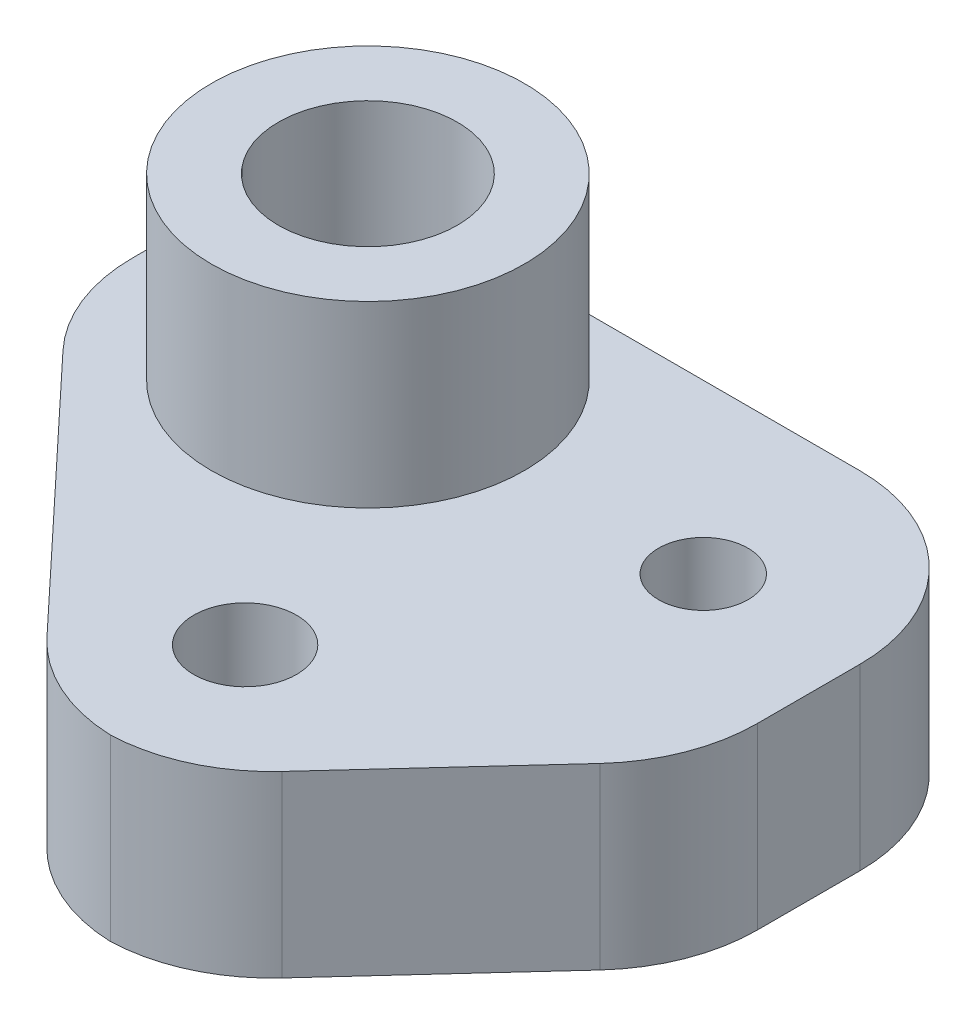
ISO-10303-21;
HEADER;
FILE_DESCRIPTION(('STEP AP214'),'2;1');
FILE_NAME('part.step','',(''),(''),'','','');
FILE_SCHEMA(('AUTOMOTIVE_DESIGN { 1 0 10303 214 1 1 1 1 }'));
ENDSEC;
DATA;
#1=APPLICATION_CONTEXT('core data for automotive mechanical design processes');
#2=APPLICATION_PROTOCOL_DEFINITION('international standard','automotive_design',2000,#1);
#3=PRODUCT_CONTEXT('',#1,'mechanical');
#4=PRODUCT('Part','Part','',(#3));
#5=PRODUCT_RELATED_PRODUCT_CATEGORY('part','',(#4));
#6=PRODUCT_DEFINITION_FORMATION('','',#4);
#7=PRODUCT_DEFINITION_CONTEXT('part definition',#1,'design');
#8=PRODUCT_DEFINITION('design','',#6,#7);
#9=PRODUCT_DEFINITION_SHAPE('','',#8);
#10=(LENGTH_UNIT() NAMED_UNIT(*) SI_UNIT(.MILLI.,.METRE.));
#11=(NAMED_UNIT(*) PLANE_ANGLE_UNIT() SI_UNIT($,.RADIAN.));
#12=(NAMED_UNIT(*) SI_UNIT($,.STERADIAN.) SOLID_ANGLE_UNIT());
#13=UNCERTAINTY_MEASURE_WITH_UNIT(LENGTH_MEASURE(1.E-05),#10,'distance_accuracy_value','');
#14=(GEOMETRIC_REPRESENTATION_CONTEXT(3) GLOBAL_UNCERTAINTY_ASSIGNED_CONTEXT((#13)) GLOBAL_UNIT_ASSIGNED_CONTEXT((#10,
#11,#12)) REPRESENTATION_CONTEXT('',''));
#15=CARTESIAN_POINT('',(0.,0.,0.));
#16=DIRECTION('',(0.,0.,1.));
#17=DIRECTION('',(1.,0.,0.));
#18=AXIS2_PLACEMENT_3D('',#15,#16,#17);
#19=CARTESIAN_POINT('',(15.6905660377359,8.,14.3830188679245));
#20=DIRECTION('',(-0.737154140200741,0.,-0.675724628517346));
#21=DIRECTION('',(-0.675724628517346,0.,0.737154140200741));
#22=AXIS2_PLACEMENT_3D('',#19,#20,#21);
#23=PLANE('',#22);
#24=DIRECTION('',(0.675724628517346,0.,-0.737154140200741));
#25=VECTOR('',#24,1.);
#26=CARTESIAN_POINT('',(15.6905660377359,8.,14.3830188679245));
#27=LINE('',#26,#25);
#28=CARTESIAN_POINT('',(13.2293931789433,8.,17.0679347138801));
#29=VERTEX_POINT('',#28);
#30=CARTESIAN_POINT('',(20.0286560515056,8.,9.65055703472122));
#31=VERTEX_POINT('',#30);
#32=EDGE_CURVE('E208',#29,#31,#27,.T.);
#33=ORIENTED_EDGE('',*,*,#32,.F.);
#34=DIRECTION('',(0.,-1.,0.));
#35=VECTOR('',#34,1.);
#36=CARTESIAN_POINT('',(13.2293931789433,8.,17.0679347138801));
#37=LINE('',#36,#35);
#38=CARTESIAN_POINT('',(13.2293931789433,0.,17.0679347138801));
#39=VERTEX_POINT('',#38);
#40=EDGE_CURVE('E173',#29,#39,#37,.T.);
#41=ORIENTED_EDGE('',*,*,#40,.T.);
#42=DIRECTION('',(0.675724628517346,0.,-0.737154140200741));
#43=VECTOR('',#42,1.);
#44=CARTESIAN_POINT('',(15.6905660377359,0.,14.3830188679245));
#45=LINE('',#44,#43);
#46=CARTESIAN_POINT('',(20.0286560515056,0.,9.65055703472122));
#47=VERTEX_POINT('',#46);
#48=EDGE_CURVE('E219',#39,#47,#45,.T.);
#49=ORIENTED_EDGE('',*,*,#48,.T.);
#50=DIRECTION('',(0.,-1.,0.));
#51=VECTOR('',#50,1.);
#52=CARTESIAN_POINT('',(20.0286560515056,8.,9.65055703472122));
#53=LINE('',#52,#51);
#54=EDGE_CURVE('E171',#47,#31,#53,.F.);
#55=ORIENTED_EDGE('',*,*,#54,.T.);
#56=EDGE_LOOP('',(#33,#41,#49,#55));
#57=FACE_BOUND('',#56,.T.);
#58=ADVANCED_FACE('F39',(#57),#23,.F.);
#59=CARTESIAN_POINT('',(22.,8.,0.));
#60=DIRECTION('',(1.,0.,0.));
#61=DIRECTION('',(0.,0.,-1.));
#62=AXIS2_PLACEMENT_3D('',#59,#60,#61);
#63=PLANE('',#62);
#64=DIRECTION('',(0.,0.,1.));
#65=VECTOR('',#64,1.);
#66=CARTESIAN_POINT('',(22.,8.,0.));
#67=LINE('',#66,#65);
#68=CARTESIAN_POINT('',(22.,8.,0.));
#69=VERTEX_POINT('',#68);
#70=CARTESIAN_POINT('',(22.,8.,4.58262232084112));
#71=VERTEX_POINT('',#70);
#72=EDGE_CURVE('E209',#69,#71,#67,.T.);
#73=ORIENTED_EDGE('',*,*,#72,.T.);
#74=DIRECTION('',(0.,-1.,0.));
#75=VECTOR('',#74,1.);
#76=CARTESIAN_POINT('',(22.,0.,4.58262232084112));
#77=LINE('',#76,#75);
#78=CARTESIAN_POINT('',(22.,0.,4.58262232084112));
#79=VERTEX_POINT('',#78);
#80=EDGE_CURVE('E11',#71,#79,#77,.T.);
#81=ORIENTED_EDGE('',*,*,#80,.T.);
#82=DIRECTION('',(0.,0.,1.));
#83=VECTOR('',#82,1.);
#84=CARTESIAN_POINT('',(22.,0.,0.));
#85=LINE('',#84,#83);
#86=CARTESIAN_POINT('',(22.,0.,0.));
#87=VERTEX_POINT('',#86);
#88=EDGE_CURVE('E222',#87,#79,#85,.T.);
#89=ORIENTED_EDGE('',*,*,#88,.F.);
#90=DIRECTION('',(0.,-1.,0.));
#91=VECTOR('',#90,1.);
#92=CARTESIAN_POINT('',(22.,8.,0.));
#93=LINE('',#92,#91);
#94=EDGE_CURVE('E166',#87,#69,#93,.F.);
#95=ORIENTED_EDGE('',*,*,#94,.T.);
#96=EDGE_LOOP('',(#73,#81,#89,#95));
#97=FACE_BOUND('',#96,.T.);
#98=ADVANCED_FACE('F235',(#97),#63,.T.);
#99=CARTESIAN_POINT('',(0.,8.,-7.5));
#100=DIRECTION('',(0.,0.,-1.));
#101=DIRECTION('',(-1.,0.,0.));
#102=AXIS2_PLACEMENT_3D('',#99,#100,#101);
#103=PLANE('',#102);
#104=DIRECTION('',(1.,0.,0.));
#105=VECTOR('',#104,1.);
#106=CARTESIAN_POINT('',(0.,0.,-7.5));
#107=LINE('',#106,#105);
#108=CARTESIAN_POINT('',(-2.5,0.,-7.5));
#109=VERTEX_POINT('',#108);
#110=CARTESIAN_POINT('',(14.5,0.,-7.5));
#111=VERTEX_POINT('',#110);
#112=EDGE_CURVE('E137',#109,#111,#107,.T.);
#113=ORIENTED_EDGE('',*,*,#112,.F.);
#114=DIRECTION('',(0.,-1.,0.));
#115=VECTOR('',#114,1.);
#116=CARTESIAN_POINT('',(-2.5,8.,-7.5));
#117=LINE('',#116,#115);
#118=CARTESIAN_POINT('',(-2.5,8.,-7.5));
#119=VERTEX_POINT('',#118);
#120=EDGE_CURVE('E145',#109,#119,#117,.F.);
#121=ORIENTED_EDGE('',*,*,#120,.T.);
#122=DIRECTION('',(1.,0.,0.));
#123=VECTOR('',#122,1.);
#124=CARTESIAN_POINT('',(0.,8.,-7.5));
#125=LINE('',#124,#123);
#126=CARTESIAN_POINT('',(14.5,8.,-7.5));
#127=VERTEX_POINT('',#126);
#128=EDGE_CURVE('E199',#119,#127,#125,.T.);
#129=ORIENTED_EDGE('',*,*,#128,.T.);
#130=DIRECTION('',(0.,-1.,0.));
#131=VECTOR('',#130,1.);
#132=CARTESIAN_POINT('',(14.5,8.,-7.5));
#133=LINE('',#132,#131);
#134=EDGE_CURVE('E146',#127,#111,#133,.T.);
#135=ORIENTED_EDGE('',*,*,#134,.T.);
#136=EDGE_LOOP('',(#113,#121,#129,#135));
#137=FACE_BOUND('',#136,.T.);
#138=ADVANCED_FACE('F228',(#137),#103,.T.);
#139=CARTESIAN_POINT('',(-10.,8.,0.));
#140=DIRECTION('',(-1.,0.,0.));
#141=DIRECTION('',(0.,0.,1.));
#142=AXIS2_PLACEMENT_3D('',#139,#140,#141);
#143=PLANE('',#142);
#144=DIRECTION('',(0.,0.,-1.));
#145=VECTOR('',#144,1.);
#146=CARTESIAN_POINT('',(-10.,0.,0.));
#147=LINE('',#146,#145);
#148=CARTESIAN_POINT('',(-10.,0.,0.534143900269346));
#149=VERTEX_POINT('',#148);
#150=CARTESIAN_POINT('',(-10.,0.,0.));
#151=VERTEX_POINT('',#150);
#152=EDGE_CURVE('E124',#149,#151,#147,.T.);
#153=ORIENTED_EDGE('',*,*,#152,.F.);
#154=DIRECTION('',(0.,-1.,0.));
#155=VECTOR('',#154,1.);
#156=CARTESIAN_POINT('',(-10.,8.,0.534143900269346));
#157=LINE('',#156,#155);
#158=CARTESIAN_POINT('',(-10.,8.,0.534143900269346));
#159=VERTEX_POINT('',#158);
#160=EDGE_CURVE('E48',#149,#159,#157,.F.);
#161=ORIENTED_EDGE('',*,*,#160,.T.);
#162=DIRECTION('',(0.,0.,-1.));
#163=VECTOR('',#162,1.);
#164=CARTESIAN_POINT('',(-10.,8.,0.));
#165=LINE('',#164,#163);
#166=CARTESIAN_POINT('',(-10.,8.,0.));
#167=VERTEX_POINT('',#166);
#168=EDGE_CURVE('E151',#159,#167,#165,.T.);
#169=ORIENTED_EDGE('',*,*,#168,.T.);
#170=DIRECTION('',(0.,-1.,0.));
#171=VECTOR('',#170,1.);
#172=CARTESIAN_POINT('',(-10.,8.,0.));
#173=LINE('',#172,#171);
#174=EDGE_CURVE('E144',#167,#151,#173,.T.);
#175=ORIENTED_EDGE('',*,*,#174,.T.);
#176=EDGE_LOOP('',(#153,#161,#169,#175));
#177=FACE_BOUND('',#176,.T.);
#178=ADVANCED_FACE('F149',(#177),#143,.T.);
#179=CARTESIAN_POINT('',(-7.06860706860707,8.,6.62681912681913));
#180=DIRECTION('',(0.729537204140085,0.,-0.68394112888133));
#181=DIRECTION('',(-0.68394112888133,0.,-0.729537204140085));
#182=AXIS2_PLACEMENT_3D('',#179,#180,#181);
#183=PLANE('',#182);
#184=DIRECTION('',(0.68394112888133,0.,0.729537204140085));
#185=VECTOR('',#184,1.);
#186=CARTESIAN_POINT('',(-7.06860706860707,0.,6.62681912681913));
#187=LINE('',#186,#185);
#188=CARTESIAN_POINT('',(-7.97152903105064,0.,5.66370236687932));
#189=VERTEX_POINT('',#188);
#190=CARTESIAN_POINT('',(2.77771106244685,0.,17.12955846661));
#191=VERTEX_POINT('',#190);
#192=EDGE_CURVE('E136',#189,#191,#187,.T.);
#193=ORIENTED_EDGE('',*,*,#192,.T.);
#194=DIRECTION('',(0.,-1.,0.));
#195=VECTOR('',#194,1.);
#196=CARTESIAN_POINT('',(2.77771106244685,8.,17.12955846661));
#197=LINE('',#196,#195);
#198=CARTESIAN_POINT('',(2.77771106244685,8.,17.12955846661));
#199=VERTEX_POINT('',#198);
#200=EDGE_CURVE('E192',#191,#199,#197,.F.);
#201=ORIENTED_EDGE('',*,*,#200,.T.);
#202=DIRECTION('',(0.68394112888133,0.,0.729537204140085));
#203=VECTOR('',#202,1.);
#204=CARTESIAN_POINT('',(-7.06860706860707,8.,6.62681912681913));
#205=LINE('',#204,#203);
#206=CARTESIAN_POINT('',(-7.97152903105064,8.,5.66370236687932));
#207=VERTEX_POINT('',#206);
#208=EDGE_CURVE('E153',#207,#199,#205,.T.);
#209=ORIENTED_EDGE('',*,*,#208,.F.);
#210=DIRECTION('',(0.,-1.,0.));
#211=VECTOR('',#210,1.);
#212=CARTESIAN_POINT('',(-7.97152903105064,0.,5.66370236687932));
#213=LINE('',#212,#211);
#214=EDGE_CURVE('E189',#207,#189,#213,.T.);
#215=ORIENTED_EDGE('',*,*,#214,.T.);
#216=EDGE_LOOP('',(#193,#201,#209,#215));
#217=FACE_BOUND('',#216,.T.);
#218=ADVANCED_FACE('F205',(#217),#183,.F.);
#219=CARTESIAN_POINT('',(0.,8.,0.));
#220=DIRECTION('',(0.,1.,0.));
#221=DIRECTION('',(0.,0.,1.));
#222=AXIS2_PLACEMENT_3D('',#219,#220,#221);
#223=PLANE('',#222);
#224=CARTESIAN_POINT('',(0.,8.,0.));
#225=DIRECTION('',(0.,1.,0.));
#226=DIRECTION('',(0.,0.,1.));
#227=AXIS2_PLACEMENT_3D('',#224,#225,#226);
#228=CIRCLE('',#227,7.);
#229=CARTESIAN_POINT('',(0.,8.,7.));
#230=VERTEX_POINT('',#229);
#231=EDGE_CURVE('E276',#230,#230,#228,.T.);
#232=ORIENTED_EDGE('',*,*,#231,.F.);
#233=EDGE_LOOP('',(#232));
#234=FACE_BOUND('',#233,.T.);
#235=CARTESIAN_POINT('',(15.,8.,0.));
#236=DIRECTION('',(0.,1.,0.));
#237=DIRECTION('',(0.,0.,1.));
#238=AXIS2_PLACEMENT_3D('',#235,#236,#237);
#239=CIRCLE('',#238,2.);
#240=CARTESIAN_POINT('',(15.,8.,2.));
#241=VERTEX_POINT('',#240);
#242=EDGE_CURVE('E287',#241,#241,#239,.T.);
#243=ORIENTED_EDGE('',*,*,#242,.F.);
#244=EDGE_LOOP('',(#243));
#245=FACE_BOUND('',#244,.T.);
#246=CARTESIAN_POINT('',(7.49999999999997,8.,12.9903810567666));
#247=DIRECTION('',(0.,1.,0.));
#248=DIRECTION('',(0.,0.,1.));
#249=AXIS2_PLACEMENT_3D('',#246,#247,#248);
#250=CIRCLE('',#249,2.3);
#251=CARTESIAN_POINT('',(7.49999999999997,8.,15.2903810567666));
#252=VERTEX_POINT('',#251);
#253=EDGE_CURVE('E285',#252,#252,#250,.T.);
#254=ORIENTED_EDGE('',*,*,#253,.F.);
#255=EDGE_LOOP('',(#254));
#256=FACE_BOUND('',#255,.T.);
#257=CARTESIAN_POINT('',(8.24924009349749,8.,12.));
#258=DIRECTION('',(0.,1.,0.));
#259=DIRECTION('',(0.,0.,1.));
#260=AXIS2_PLACEMENT_3D('',#257,#258,#259);
#261=CIRCLE('',#260,7.5);
#262=CARTESIAN_POINT('',(7.97498861046759,8.,19.4949840642963));
#263=VERTEX_POINT('',#262);
#264=EDGE_CURVE('E55',#199,#263,#261,.T.);
#265=ORIENTED_EDGE('',*,*,#264,.T.);
#266=CARTESIAN_POINT('',(7.70073712743769,8.,12.));
#267=DIRECTION('',(0.,1.,0.));
#268=DIRECTION('',(0.,0.,1.));
#269=AXIS2_PLACEMENT_3D('',#266,#267,#268);
#270=CIRCLE('',#269,7.5);
#271=EDGE_CURVE('E187',#263,#29,#270,.T.);
#272=ORIENTED_EDGE('',*,*,#271,.T.);
#273=ORIENTED_EDGE('',*,*,#32,.T.);
#274=CARTESIAN_POINT('',(14.5,8.,4.58262232084112));
#275=DIRECTION('',(0.,1.,0.));
#276=DIRECTION('',(0.,0.,1.));
#277=AXIS2_PLACEMENT_3D('',#274,#275,#276);
#278=CIRCLE('',#277,7.5);
#279=EDGE_CURVE('E62',#31,#71,#278,.T.);
#280=ORIENTED_EDGE('',*,*,#279,.T.);
#281=ORIENTED_EDGE('',*,*,#72,.F.);
#282=CARTESIAN_POINT('',(14.5,8.,0.));
#283=DIRECTION('',(0.,1.,0.));
#284=DIRECTION('',(0.,0.,1.));
#285=AXIS2_PLACEMENT_3D('',#282,#283,#284);
#286=CIRCLE('',#285,7.5);
#287=EDGE_CURVE('E162',#69,#127,#286,.T.);
#288=ORIENTED_EDGE('',*,*,#287,.T.);
#289=ORIENTED_EDGE('',*,*,#128,.F.);
#290=CARTESIAN_POINT('',(-2.5,8.,0.));
#291=DIRECTION('',(0.,1.,0.));
#292=DIRECTION('',(0.,0.,1.));
#293=AXIS2_PLACEMENT_3D('',#290,#291,#292);
#294=CIRCLE('',#293,7.5);
#295=EDGE_CURVE('E164',#119,#167,#294,.T.);
#296=ORIENTED_EDGE('',*,*,#295,.T.);
#297=ORIENTED_EDGE('',*,*,#168,.F.);
#298=CARTESIAN_POINT('',(-2.5,8.,0.534143900269345));
#299=DIRECTION('',(0.,1.,0.));
#300=DIRECTION('',(0.,0.,1.));
#301=AXIS2_PLACEMENT_3D('',#298,#299,#300);
#302=CIRCLE('',#301,7.5);
#303=EDGE_CURVE('E184',#159,#207,#302,.T.);
#304=ORIENTED_EDGE('',*,*,#303,.T.);
#305=ORIENTED_EDGE('',*,*,#208,.T.);
#306=EDGE_LOOP('',(#265,#272,#273,#280,#281,#288,#289,#296,#297,#304,#305));
#307=FACE_BOUND('',#306,.T.);
#308=ADVANCED_FACE('F196',(#234,#245,#256,#307),#223,.T.);
#309=CARTESIAN_POINT('',(0.,0.,0.));
#310=DIRECTION('',(0.,1.,0.));
#311=DIRECTION('',(0.,0.,1.));
#312=AXIS2_PLACEMENT_3D('',#309,#310,#311);
#313=PLANE('',#312);
#314=CARTESIAN_POINT('',(15.,0.,0.));
#315=DIRECTION('',(0.,1.,0.));
#316=DIRECTION('',(0.,0.,1.));
#317=AXIS2_PLACEMENT_3D('',#314,#315,#316);
#318=CIRCLE('',#317,2.);
#319=CARTESIAN_POINT('',(15.,0.,2.));
#320=VERTEX_POINT('',#319);
#321=EDGE_CURVE('E223',#320,#320,#318,.F.);
#322=ORIENTED_EDGE('',*,*,#321,.F.);
#323=EDGE_LOOP('',(#322));
#324=FACE_BOUND('',#323,.T.);
#325=CARTESIAN_POINT('',(7.49999999999997,0.,12.9903810567666));
#326=DIRECTION('',(0.,1.,0.));
#327=DIRECTION('',(0.,0.,1.));
#328=AXIS2_PLACEMENT_3D('',#325,#326,#327);
#329=CIRCLE('',#328,2.3);
#330=CARTESIAN_POINT('',(7.49999999999997,0.,15.2903810567666));
#331=VERTEX_POINT('',#330);
#332=EDGE_CURVE('E214',#331,#331,#329,.F.);
#333=ORIENTED_EDGE('',*,*,#332,.F.);
#334=EDGE_LOOP('',(#333));
#335=FACE_BOUND('',#334,.T.);
#336=ORIENTED_EDGE('',*,*,#48,.F.);
#337=CARTESIAN_POINT('',(7.70073712743769,0.,12.));
#338=DIRECTION('',(0.,1.,0.));
#339=DIRECTION('',(0.,0.,1.));
#340=AXIS2_PLACEMENT_3D('',#337,#338,#339);
#341=CIRCLE('',#340,7.5);
#342=CARTESIAN_POINT('',(7.97498861046759,0.,19.4949840642963));
#343=VERTEX_POINT('',#342);
#344=EDGE_CURVE('E181',#39,#343,#341,.F.);
#345=ORIENTED_EDGE('',*,*,#344,.T.);
#346=CARTESIAN_POINT('',(8.24924009349749,0.,12.));
#347=DIRECTION('',(0.,1.,0.));
#348=DIRECTION('',(0.,0.,1.));
#349=AXIS2_PLACEMENT_3D('',#346,#347,#348);
#350=CIRCLE('',#349,7.5);
#351=EDGE_CURVE('E179',#343,#191,#350,.F.);
#352=ORIENTED_EDGE('',*,*,#351,.T.);
#353=ORIENTED_EDGE('',*,*,#192,.F.);
#354=CARTESIAN_POINT('',(-2.5,0.,0.534143900269345));
#355=DIRECTION('',(0.,1.,0.));
#356=DIRECTION('',(0.,0.,1.));
#357=AXIS2_PLACEMENT_3D('',#354,#355,#356);
#358=CIRCLE('',#357,7.5);
#359=EDGE_CURVE('E132',#189,#149,#358,.F.);
#360=ORIENTED_EDGE('',*,*,#359,.T.);
#361=ORIENTED_EDGE('',*,*,#152,.T.);
#362=CARTESIAN_POINT('',(-2.5,0.,0.));
#363=DIRECTION('',(0.,1.,0.));
#364=DIRECTION('',(0.,0.,1.));
#365=AXIS2_PLACEMENT_3D('',#362,#363,#364);
#366=CIRCLE('',#365,7.5);
#367=EDGE_CURVE('E129',#151,#109,#366,.F.);
#368=ORIENTED_EDGE('',*,*,#367,.T.);
#369=ORIENTED_EDGE('',*,*,#112,.T.);
#370=CARTESIAN_POINT('',(14.5,0.,0.));
#371=DIRECTION('',(0.,1.,0.));
#372=DIRECTION('',(0.,0.,1.));
#373=AXIS2_PLACEMENT_3D('',#370,#371,#372);
#374=CIRCLE('',#373,7.5);
#375=EDGE_CURVE('E147',#111,#87,#374,.F.);
#376=ORIENTED_EDGE('',*,*,#375,.T.);
#377=ORIENTED_EDGE('',*,*,#88,.T.);
#378=CARTESIAN_POINT('',(14.5,0.,4.58262232084112));
#379=DIRECTION('',(0.,1.,0.));
#380=DIRECTION('',(0.,0.,1.));
#381=AXIS2_PLACEMENT_3D('',#378,#379,#380);
#382=CIRCLE('',#381,7.5);
#383=EDGE_CURVE('E176',#79,#47,#382,.F.);
#384=ORIENTED_EDGE('',*,*,#383,.T.);
#385=EDGE_LOOP('',(#336,#345,#352,#353,#360,#361,#368,#369,#376,#377,#384));
#386=FACE_BOUND('',#385,.T.);
#387=ADVANCED_FACE('F127',(#324,#335,#386),#313,.F.);
#388=CARTESIAN_POINT('',(-2.5,8.,0.));
#389=DIRECTION('',(0.,-1.,0.));
#390=DIRECTION('',(0.,0.,-1.));
#391=AXIS2_PLACEMENT_3D('',#388,#389,#390);
#392=CYLINDRICAL_SURFACE('',#391,7.5);
#393=ORIENTED_EDGE('',*,*,#295,.F.);
#394=ORIENTED_EDGE('',*,*,#120,.F.);
#395=ORIENTED_EDGE('',*,*,#367,.F.);
#396=ORIENTED_EDGE('',*,*,#174,.F.);
#397=EDGE_LOOP('',(#393,#394,#395,#396));
#398=FACE_BOUND('',#397,.T.);
#399=ADVANCED_FACE('F143',(#398),#392,.T.);
#400=CARTESIAN_POINT('',(14.5,8.,0.));
#401=DIRECTION('',(0.,-1.,0.));
#402=DIRECTION('',(0.,0.,-1.));
#403=AXIS2_PLACEMENT_3D('',#400,#401,#402);
#404=CYLINDRICAL_SURFACE('',#403,7.5);
#405=ORIENTED_EDGE('',*,*,#287,.F.);
#406=ORIENTED_EDGE('',*,*,#94,.F.);
#407=ORIENTED_EDGE('',*,*,#375,.F.);
#408=ORIENTED_EDGE('',*,*,#134,.F.);
#409=EDGE_LOOP('',(#405,#406,#407,#408));
#410=FACE_BOUND('',#409,.T.);
#411=ADVANCED_FACE('F232',(#410),#404,.T.);
#412=CARTESIAN_POINT('',(7.49999999999997,-0.000999999999999265,12.9903810567666));
#413=DIRECTION('',(0.,1.,0.));
#414=DIRECTION('',(0.,0.,1.));
#415=AXIS2_PLACEMENT_3D('',#412,#413,#414);
#416=CYLINDRICAL_SURFACE('',#415,2.3);
#417=ORIENTED_EDGE('',*,*,#253,.T.);
#418=EDGE_LOOP('',(#417));
#419=FACE_BOUND('',#418,.T.);
#420=ORIENTED_EDGE('',*,*,#332,.T.);
#421=EDGE_LOOP('',(#420));
#422=FACE_BOUND('',#421,.T.);
#423=ADVANCED_FACE('F258',(#419,#422),#416,.F.);
#424=CARTESIAN_POINT('',(15.,-0.000999999999999265,0.));
#425=DIRECTION('',(0.,1.,0.));
#426=DIRECTION('',(0.,0.,1.));
#427=AXIS2_PLACEMENT_3D('',#424,#425,#426);
#428=CYLINDRICAL_SURFACE('',#427,2.);
#429=ORIENTED_EDGE('',*,*,#242,.T.);
#430=EDGE_LOOP('',(#429));
#431=FACE_BOUND('',#430,.T.);
#432=ORIENTED_EDGE('',*,*,#321,.T.);
#433=EDGE_LOOP('',(#432));
#434=FACE_BOUND('',#433,.T.);
#435=ADVANCED_FACE('F384',(#431,#434),#428,.F.);
#436=CARTESIAN_POINT('',(0.,16.,0.));
#437=DIRECTION('',(0.,1.,0.));
#438=DIRECTION('',(0.,0.,1.));
#439=AXIS2_PLACEMENT_3D('',#436,#437,#438);
#440=PLANE('',#439);
#441=CARTESIAN_POINT('',(0.,16.,0.));
#442=DIRECTION('',(0.,1.,0.));
#443=DIRECTION('',(0.,0.,1.));
#444=AXIS2_PLACEMENT_3D('',#441,#442,#443);
#445=CIRCLE('',#444,7.);
#446=CARTESIAN_POINT('',(0.,16.,7.));
#447=VERTEX_POINT('',#446);
#448=EDGE_CURVE('E281',#447,#447,#445,.T.);
#449=ORIENTED_EDGE('',*,*,#448,.T.);
#450=EDGE_LOOP('',(#449));
#451=FACE_BOUND('',#450,.T.);
#452=CARTESIAN_POINT('',(0.,16.,0.));
#453=DIRECTION('',(0.,1.,0.));
#454=DIRECTION('',(0.,0.,1.));
#455=AXIS2_PLACEMENT_3D('',#452,#453,#454);
#456=CIRCLE('',#455,4.);
#457=CARTESIAN_POINT('',(0.,16.,4.));
#458=VERTEX_POINT('',#457);
#459=EDGE_CURVE('E274',#458,#458,#456,.T.);
#460=ORIENTED_EDGE('',*,*,#459,.F.);
#461=EDGE_LOOP('',(#460));
#462=FACE_BOUND('',#461,.T.);
#463=ADVANCED_FACE('F375',(#451,#462),#440,.T.);
#464=CARTESIAN_POINT('',(0.,16.,0.));
#465=DIRECTION('',(0.,-1.,0.));
#466=DIRECTION('',(0.,0.,-1.));
#467=AXIS2_PLACEMENT_3D('',#464,#465,#466);
#468=CYLINDRICAL_SURFACE('',#467,7.);
#469=ORIENTED_EDGE('',*,*,#448,.F.);
#470=EDGE_LOOP('',(#469));
#471=FACE_BOUND('',#470,.T.);
#472=ORIENTED_EDGE('',*,*,#231,.T.);
#473=EDGE_LOOP('',(#472));
#474=FACE_BOUND('',#473,.T.);
#475=ADVANCED_FACE('F366',(#471,#474),#468,.T.);
#476=CARTESIAN_POINT('',(0.,16.,0.));
#477=DIRECTION('',(0.,-1.,0.));
#478=DIRECTION('',(0.,0.,-1.));
#479=AXIS2_PLACEMENT_3D('',#476,#477,#478);
#480=CYLINDRICAL_SURFACE('',#479,4.);
#481=ORIENTED_EDGE('',*,*,#459,.T.);
#482=EDGE_LOOP('',(#481));
#483=FACE_BOUND('',#482,.T.);
#484=CARTESIAN_POINT('',(0.,8.,0.));
#485=DIRECTION('',(0.,1.,0.));
#486=DIRECTION('',(0.,0.,1.));
#487=AXIS2_PLACEMENT_3D('',#484,#485,#486);
#488=CIRCLE('',#487,4.);
#489=CARTESIAN_POINT('',(0.,8.,4.));
#490=VERTEX_POINT('',#489);
#491=EDGE_CURVE('E168',#490,#490,#488,.F.);
#492=ORIENTED_EDGE('',*,*,#491,.T.);
#493=EDGE_LOOP('',(#492));
#494=FACE_BOUND('',#493,.T.);
#495=ADVANCED_FACE('F269',(#483,#494),#480,.F.);
#496=ORIENTED_EDGE('',*,*,#491,.F.);
#497=EDGE_LOOP('',(#496));
#498=FACE_BOUND('',#497,.T.);
#499=ADVANCED_FACE('F264',(#498),#223,.T.);
#500=CARTESIAN_POINT('',(8.24924009349749,8.,12.));
#501=DIRECTION('',(0.,-1.,0.));
#502=DIRECTION('',(0.,0.,-1.));
#503=AXIS2_PLACEMENT_3D('',#500,#501,#502);
#504=CYLINDRICAL_SURFACE('',#503,7.5);
#505=DIRECTION('',(0.,-1.,0.));
#506=VECTOR('',#505,1.);
#507=CARTESIAN_POINT('',(7.97498861046759,4.,19.4949840642963));
#508=LINE('',#507,#506);
#509=EDGE_CURVE('E43',#263,#343,#508,.T.);
#510=ORIENTED_EDGE('',*,*,#509,.F.);
#511=ORIENTED_EDGE('',*,*,#264,.F.);
#512=ORIENTED_EDGE('',*,*,#200,.F.);
#513=ORIENTED_EDGE('',*,*,#351,.F.);
#514=EDGE_LOOP('',(#510,#511,#512,#513));
#515=FACE_BOUND('',#514,.T.);
#516=ADVANCED_FACE('F261',(#515),#504,.T.);
#517=CARTESIAN_POINT('',(7.70073712743769,8.,12.));
#518=DIRECTION('',(0.,-1.,0.));
#519=DIRECTION('',(0.,0.,-1.));
#520=AXIS2_PLACEMENT_3D('',#517,#518,#519);
#521=CYLINDRICAL_SURFACE('',#520,7.5);
#522=ORIENTED_EDGE('',*,*,#271,.F.);
#523=ORIENTED_EDGE('',*,*,#509,.T.);
#524=ORIENTED_EDGE('',*,*,#344,.F.);
#525=ORIENTED_EDGE('',*,*,#40,.F.);
#526=EDGE_LOOP('',(#522,#523,#524,#525));
#527=FACE_BOUND('',#526,.T.);
#528=ADVANCED_FACE('F245',(#527),#521,.T.);
#529=CARTESIAN_POINT('',(-2.5,8.,0.534143900269345));
#530=DIRECTION('',(0.,1.,0.));
#531=DIRECTION('',(0.,0.,1.));
#532=AXIS2_PLACEMENT_3D('',#529,#530,#531);
#533=CYLINDRICAL_SURFACE('',#532,7.5);
#534=ORIENTED_EDGE('',*,*,#303,.F.);
#535=ORIENTED_EDGE('',*,*,#160,.F.);
#536=ORIENTED_EDGE('',*,*,#359,.F.);
#537=ORIENTED_EDGE('',*,*,#214,.F.);
#538=EDGE_LOOP('',(#534,#535,#536,#537));
#539=FACE_BOUND('',#538,.T.);
#540=ADVANCED_FACE('F202',(#539),#533,.T.);
#541=CARTESIAN_POINT('',(14.5,8.,4.58262232084112));
#542=DIRECTION('',(0.,1.,0.));
#543=DIRECTION('',(0.,0.,1.));
#544=AXIS2_PLACEMENT_3D('',#541,#542,#543);
#545=CYLINDRICAL_SURFACE('',#544,7.5);
#546=ORIENTED_EDGE('',*,*,#279,.F.);
#547=ORIENTED_EDGE('',*,*,#54,.F.);
#548=ORIENTED_EDGE('',*,*,#383,.F.);
#549=ORIENTED_EDGE('',*,*,#80,.F.);
#550=EDGE_LOOP('',(#546,#547,#548,#549));
#551=FACE_BOUND('',#550,.T.);
#552=ADVANCED_FACE('F41',(#551),#545,.T.);
#553=CLOSED_SHELL('',(#58,#98,#138,#178,#218,#308,#387,#399,#411,#423,#435,#463,#475,#495,#499,
#516,#528,#540,#552));
#554=MANIFOLD_SOLID_BREP('B2',#553);
#555=ADVANCED_BREP_SHAPE_REPRESENTATION('',(#18,#554),#14);
#556=SHAPE_DEFINITION_REPRESENTATION(#9,#555);
ENDSEC;
END-ISO-10303-21;
